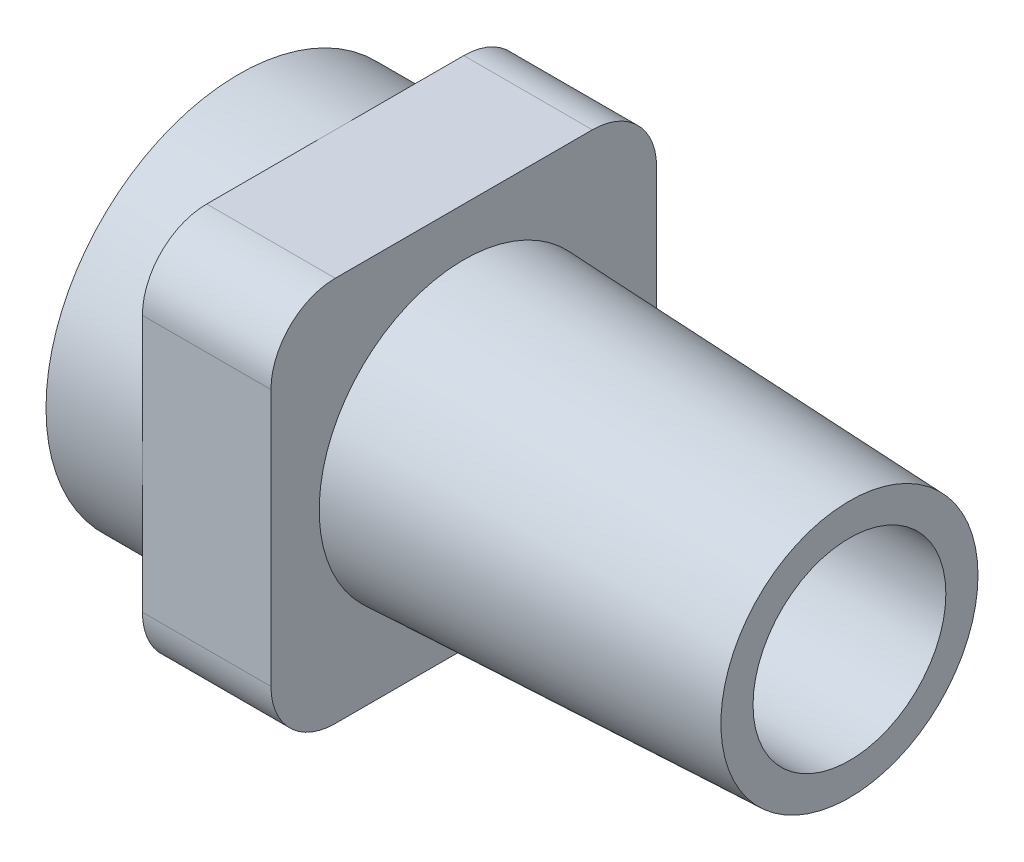
ISO-10303-21;
HEADER;
FILE_DESCRIPTION(('STEP AP214'),'2;1');
FILE_NAME('part.step','',(''),(''),'','','');
FILE_SCHEMA(('AUTOMOTIVE_DESIGN { 1 0 10303 214 1 1 1 1 }'));
ENDSEC;
DATA;
#1=APPLICATION_CONTEXT('core data for automotive mechanical design processes');
#2=APPLICATION_PROTOCOL_DEFINITION('international standard','automotive_design',2000,#1);
#3=PRODUCT_CONTEXT('',#1,'mechanical');
#4=PRODUCT('Part','Part','',(#3));
#5=PRODUCT_RELATED_PRODUCT_CATEGORY('part','',(#4));
#6=PRODUCT_DEFINITION_FORMATION('','',#4);
#7=PRODUCT_DEFINITION_CONTEXT('part definition',#1,'design');
#8=PRODUCT_DEFINITION('design','',#6,#7);
#9=PRODUCT_DEFINITION_SHAPE('','',#8);
#10=(LENGTH_UNIT() NAMED_UNIT(*) SI_UNIT(.MILLI.,.METRE.));
#11=(NAMED_UNIT(*) PLANE_ANGLE_UNIT() SI_UNIT($,.RADIAN.));
#12=(NAMED_UNIT(*) SI_UNIT($,.STERADIAN.) SOLID_ANGLE_UNIT());
#13=UNCERTAINTY_MEASURE_WITH_UNIT(LENGTH_MEASURE(1.E-05),#10,'distance_accuracy_value','');
#14=(GEOMETRIC_REPRESENTATION_CONTEXT(3) GLOBAL_UNCERTAINTY_ASSIGNED_CONTEXT((#13)) GLOBAL_UNIT_ASSIGNED_CONTEXT((#10,
#11,#12)) REPRESENTATION_CONTEXT('',''));
#15=CARTESIAN_POINT('',(0.,0.,0.));
#16=DIRECTION('',(0.,0.,1.));
#17=DIRECTION('',(1.,0.,0.));
#18=AXIS2_PLACEMENT_3D('',#15,#16,#17);
#19=CARTESIAN_POINT('',(1.,0.,0.));
#20=DIRECTION('',(1.,0.,0.));
#21=DIRECTION('',(0.,0.,-1.));
#22=AXIS2_PLACEMENT_3D('',#19,#20,#21);
#23=PLANE('',#22);
#24=DIRECTION('',(0.,-1.,0.));
#25=VECTOR('',#24,1.);
#26=CARTESIAN_POINT('',(1.,3.,3.));
#27=LINE('',#26,#25);
#28=CARTESIAN_POINT('',(1.,2.,3.));
#29=VERTEX_POINT('',#28);
#30=CARTESIAN_POINT('',(1.,-2.,3.));
#31=VERTEX_POINT('',#30);
#32=EDGE_CURVE('E148',#29,#31,#27,.T.);
#33=ORIENTED_EDGE('',*,*,#32,.T.);
#34=CARTESIAN_POINT('',(1.,-2.,2.));
#35=DIRECTION('',(1.,0.,0.));
#36=DIRECTION('',(0.,0.,-1.));
#37=AXIS2_PLACEMENT_3D('',#34,#35,#36);
#38=CIRCLE('',#37,1.);
#39=CARTESIAN_POINT('',(1.,-3.,2.));
#40=VERTEX_POINT('',#39);
#41=EDGE_CURVE('E187',#31,#40,#38,.T.);
#42=ORIENTED_EDGE('',*,*,#41,.T.);
#43=DIRECTION('',(0.,0.,-1.));
#44=VECTOR('',#43,1.);
#45=CARTESIAN_POINT('',(1.,-3.,3.));
#46=LINE('',#45,#44);
#47=CARTESIAN_POINT('',(1.,-3.,-2.));
#48=VERTEX_POINT('',#47);
#49=EDGE_CURVE('E146',#40,#48,#46,.T.);
#50=ORIENTED_EDGE('',*,*,#49,.T.);
#51=CARTESIAN_POINT('',(1.,-2.,-2.));
#52=DIRECTION('',(1.,0.,0.));
#53=DIRECTION('',(0.,0.,-1.));
#54=AXIS2_PLACEMENT_3D('',#51,#52,#53);
#55=CIRCLE('',#54,1.);
#56=CARTESIAN_POINT('',(1.,-2.,-3.));
#57=VERTEX_POINT('',#56);
#58=EDGE_CURVE('E185',#48,#57,#55,.T.);
#59=ORIENTED_EDGE('',*,*,#58,.T.);
#60=DIRECTION('',(0.,1.,0.));
#61=VECTOR('',#60,1.);
#62=CARTESIAN_POINT('',(1.,3.,-3.));
#63=LINE('',#62,#61);
#64=CARTESIAN_POINT('',(1.,2.,-3.));
#65=VERTEX_POINT('',#64);
#66=EDGE_CURVE('E153',#57,#65,#63,.T.);
#67=ORIENTED_EDGE('',*,*,#66,.T.);
#68=CARTESIAN_POINT('',(1.,2.,-2.));
#69=DIRECTION('',(1.,0.,0.));
#70=DIRECTION('',(0.,0.,-1.));
#71=AXIS2_PLACEMENT_3D('',#68,#69,#70);
#72=CIRCLE('',#71,1.);
#73=CARTESIAN_POINT('',(1.,3.,-2.));
#74=VERTEX_POINT('',#73);
#75=EDGE_CURVE('E183',#65,#74,#72,.T.);
#76=ORIENTED_EDGE('',*,*,#75,.T.);
#77=DIRECTION('',(0.,0.,1.));
#78=VECTOR('',#77,1.);
#79=CARTESIAN_POINT('',(1.,3.,3.));
#80=LINE('',#79,#78);
#81=CARTESIAN_POINT('',(1.,3.,2.));
#82=VERTEX_POINT('',#81);
#83=EDGE_CURVE('E156',#74,#82,#80,.T.);
#84=ORIENTED_EDGE('',*,*,#83,.T.);
#85=CARTESIAN_POINT('',(1.,2.,2.));
#86=DIRECTION('',(1.,0.,0.));
#87=DIRECTION('',(0.,0.,-1.));
#88=AXIS2_PLACEMENT_3D('',#85,#86,#87);
#89=CIRCLE('',#88,1.);
#90=EDGE_CURVE('E181',#82,#29,#89,.T.);
#91=ORIENTED_EDGE('',*,*,#90,.T.);
#92=EDGE_LOOP('',(#33,#42,#50,#59,#67,#76,#84,#91));
#93=FACE_BOUND('',#92,.T.);
#94=CARTESIAN_POINT('',(1.,0.,0.));
#95=DIRECTION('',(1.,0.,0.));
#96=DIRECTION('',(0.,0.,-1.));
#97=AXIS2_PLACEMENT_3D('',#94,#95,#96);
#98=CIRCLE('',#97,2.25);
#99=CARTESIAN_POINT('',(1.,0.,-2.25));
#100=VERTEX_POINT('',#99);
#101=EDGE_CURVE('E170',#100,#100,#98,.T.);
#102=ORIENTED_EDGE('',*,*,#101,.F.);
#103=EDGE_LOOP('',(#102));
#104=FACE_BOUND('',#103,.T.);
#105=ADVANCED_FACE('F36',(#93,#104),#23,.T.);
#106=CARTESIAN_POINT('',(-1.,0.,0.));
#107=DIRECTION('',(1.,0.,0.));
#108=DIRECTION('',(0.,0.,-1.));
#109=AXIS2_PLACEMENT_3D('',#106,#107,#108);
#110=PLANE('',#109);
#111=DIRECTION('',(0.,-1.,0.));
#112=VECTOR('',#111,1.);
#113=CARTESIAN_POINT('',(-1.,3.,3.));
#114=LINE('',#113,#112);
#115=CARTESIAN_POINT('',(-1.,2.,3.));
#116=VERTEX_POINT('',#115);
#117=CARTESIAN_POINT('',(-1.,0.,3.));
#118=VERTEX_POINT('',#117);
#119=EDGE_CURVE('E112',#116,#118,#114,.T.);
#120=ORIENTED_EDGE('',*,*,#119,.F.);
#121=CARTESIAN_POINT('',(-1.,2.,2.));
#122=DIRECTION('',(1.,0.,0.));
#123=DIRECTION('',(0.,0.,-1.));
#124=AXIS2_PLACEMENT_3D('',#121,#122,#123);
#125=CIRCLE('',#124,1.);
#126=CARTESIAN_POINT('',(-1.,3.,2.));
#127=VERTEX_POINT('',#126);
#128=EDGE_CURVE('E12',#116,#127,#125,.F.);
#129=ORIENTED_EDGE('',*,*,#128,.T.);
#130=DIRECTION('',(0.,0.,1.));
#131=VECTOR('',#130,1.);
#132=CARTESIAN_POINT('',(-1.,3.,3.));
#133=LINE('',#132,#131);
#134=CARTESIAN_POINT('',(-1.,3.,0.));
#135=VERTEX_POINT('',#134);
#136=EDGE_CURVE('E135',#135,#127,#133,.T.);
#137=ORIENTED_EDGE('',*,*,#136,.F.);
#138=CARTESIAN_POINT('',(-1.,0.,0.));
#139=DIRECTION('',(-1.,0.,0.));
#140=DIRECTION('',(0.,0.,1.));
#141=AXIS2_PLACEMENT_3D('',#138,#139,#140);
#142=CIRCLE('',#141,3.);
#143=EDGE_CURVE('E133',#118,#135,#142,.T.);
#144=ORIENTED_EDGE('',*,*,#143,.F.);
#145=EDGE_LOOP('',(#120,#129,#137,#144));
#146=FACE_BOUND('',#145,.T.);
#147=ADVANCED_FACE('F134',(#146),#110,.F.);
#148=CARTESIAN_POINT('',(-1.,3.,-2.));
#149=VERTEX_POINT('',#148);
#150=EDGE_CURVE('E131',#149,#135,#133,.T.);
#151=ORIENTED_EDGE('',*,*,#150,.F.);
#152=CARTESIAN_POINT('',(-1.,2.,-2.));
#153=DIRECTION('',(1.,0.,0.));
#154=DIRECTION('',(0.,0.,-1.));
#155=AXIS2_PLACEMENT_3D('',#152,#153,#154);
#156=CIRCLE('',#155,1.);
#157=CARTESIAN_POINT('',(-1.,2.,-3.));
#158=VERTEX_POINT('',#157);
#159=EDGE_CURVE('E44',#149,#158,#156,.F.);
#160=ORIENTED_EDGE('',*,*,#159,.T.);
#161=DIRECTION('',(0.,1.,0.));
#162=VECTOR('',#161,1.);
#163=CARTESIAN_POINT('',(-1.,3.,-3.));
#164=LINE('',#163,#162);
#165=CARTESIAN_POINT('',(-1.,0.,-3.));
#166=VERTEX_POINT('',#165);
#167=EDGE_CURVE('E164',#166,#158,#164,.T.);
#168=ORIENTED_EDGE('',*,*,#167,.F.);
#169=EDGE_CURVE('E141',#135,#166,#142,.T.);
#170=ORIENTED_EDGE('',*,*,#169,.F.);
#171=EDGE_LOOP('',(#151,#160,#168,#170));
#172=FACE_BOUND('',#171,.T.);
#173=ADVANCED_FACE('F203',(#172),#110,.F.);
#174=CARTESIAN_POINT('',(-1.,-2.,-3.));
#175=VERTEX_POINT('',#174);
#176=EDGE_CURVE('E162',#175,#166,#164,.T.);
#177=ORIENTED_EDGE('',*,*,#176,.F.);
#178=CARTESIAN_POINT('',(-1.,-2.,-2.));
#179=DIRECTION('',(1.,0.,0.));
#180=DIRECTION('',(0.,0.,-1.));
#181=AXIS2_PLACEMENT_3D('',#178,#179,#180);
#182=CIRCLE('',#181,1.);
#183=CARTESIAN_POINT('',(-1.,-3.,-2.));
#184=VERTEX_POINT('',#183);
#185=EDGE_CURVE('E194',#175,#184,#182,.F.);
#186=ORIENTED_EDGE('',*,*,#185,.T.);
#187=DIRECTION('',(0.,0.,-1.));
#188=VECTOR('',#187,1.);
#189=CARTESIAN_POINT('',(-1.,-3.,3.));
#190=LINE('',#189,#188);
#191=CARTESIAN_POINT('',(-1.,-3.,0.));
#192=VERTEX_POINT('',#191);
#193=EDGE_CURVE('E121',#192,#184,#190,.T.);
#194=ORIENTED_EDGE('',*,*,#193,.F.);
#195=EDGE_CURVE('E145',#166,#192,#142,.T.);
#196=ORIENTED_EDGE('',*,*,#195,.F.);
#197=EDGE_LOOP('',(#177,#186,#194,#196));
#198=FACE_BOUND('',#197,.T.);
#199=ADVANCED_FACE('F233',(#198),#110,.F.);
#200=CARTESIAN_POINT('',(1.,3.,-3.));
#201=DIRECTION('',(0.,0.,1.));
#202=DIRECTION('',(1.,0.,0.));
#203=AXIS2_PLACEMENT_3D('',#200,#201,#202);
#204=PLANE('',#203);
#205=ORIENTED_EDGE('',*,*,#66,.F.);
#206=DIRECTION('',(-1.,0.,0.));
#207=VECTOR('',#206,1.);
#208=CARTESIAN_POINT('',(1.,-2.,-3.));
#209=LINE('',#208,#207);
#210=EDGE_CURVE('E191',#57,#175,#209,.T.);
#211=ORIENTED_EDGE('',*,*,#210,.T.);
#212=ORIENTED_EDGE('',*,*,#176,.T.);
#213=ORIENTED_EDGE('',*,*,#167,.T.);
#214=DIRECTION('',(-1.,0.,0.));
#215=VECTOR('',#214,1.);
#216=CARTESIAN_POINT('',(1.,2.,-3.));
#217=LINE('',#216,#215);
#218=EDGE_CURVE('E189',#158,#65,#217,.F.);
#219=ORIENTED_EDGE('',*,*,#218,.T.);
#220=EDGE_LOOP('',(#205,#211,#212,#213,#219));
#221=FACE_BOUND('',#220,.T.);
#222=ADVANCED_FACE('F207',(#221),#204,.F.);
#223=CARTESIAN_POINT('',(1.,3.,3.));
#224=DIRECTION('',(0.,-1.,0.));
#225=DIRECTION('',(0.,0.,-1.));
#226=AXIS2_PLACEMENT_3D('',#223,#224,#225);
#227=PLANE('',#226);
#228=ORIENTED_EDGE('',*,*,#83,.F.);
#229=DIRECTION('',(-1.,0.,0.));
#230=VECTOR('',#229,1.);
#231=CARTESIAN_POINT('',(1.,3.,-2.));
#232=LINE('',#231,#230);
#233=EDGE_CURVE('E198',#74,#149,#232,.T.);
#234=ORIENTED_EDGE('',*,*,#233,.T.);
#235=ORIENTED_EDGE('',*,*,#150,.T.);
#236=ORIENTED_EDGE('',*,*,#136,.T.);
#237=DIRECTION('',(-1.,0.,0.));
#238=VECTOR('',#237,1.);
#239=CARTESIAN_POINT('',(1.,3.,2.));
#240=LINE('',#239,#238);
#241=EDGE_CURVE('E196',#127,#82,#240,.F.);
#242=ORIENTED_EDGE('',*,*,#241,.T.);
#243=EDGE_LOOP('',(#228,#234,#235,#236,#242));
#244=FACE_BOUND('',#243,.T.);
#245=ADVANCED_FACE('F216',(#244),#227,.F.);
#246=CARTESIAN_POINT('',(1.,3.,3.));
#247=DIRECTION('',(0.,0.,-1.));
#248=DIRECTION('',(0.,1.,0.));
#249=AXIS2_PLACEMENT_3D('',#246,#247,#248);
#250=PLANE('',#249);
#251=CARTESIAN_POINT('',(-1.,-2.,3.));
#252=VERTEX_POINT('',#251);
#253=EDGE_CURVE('E115',#118,#252,#114,.T.);
#254=ORIENTED_EDGE('',*,*,#253,.T.);
#255=DIRECTION('',(-1.,0.,0.));
#256=VECTOR('',#255,1.);
#257=CARTESIAN_POINT('',(1.,-2.,3.));
#258=LINE('',#257,#256);
#259=EDGE_CURVE('E179',#252,#31,#258,.F.);
#260=ORIENTED_EDGE('',*,*,#259,.T.);
#261=ORIENTED_EDGE('',*,*,#32,.F.);
#262=DIRECTION('',(-1.,0.,0.));
#263=VECTOR('',#262,1.);
#264=CARTESIAN_POINT('',(1.,2.,3.));
#265=LINE('',#264,#263);
#266=EDGE_CURVE('E119',#29,#116,#265,.T.);
#267=ORIENTED_EDGE('',*,*,#266,.T.);
#268=ORIENTED_EDGE('',*,*,#119,.T.);
#269=EDGE_LOOP('',(#254,#260,#261,#267,#268));
#270=FACE_BOUND('',#269,.T.);
#271=ADVANCED_FACE('F114',(#270),#250,.F.);
#272=CARTESIAN_POINT('',(1.,-3.,3.));
#273=DIRECTION('',(0.,1.,0.));
#274=DIRECTION('',(0.,0.,1.));
#275=AXIS2_PLACEMENT_3D('',#272,#273,#274);
#276=PLANE('',#275);
#277=ORIENTED_EDGE('',*,*,#49,.F.);
#278=DIRECTION('',(-1.,0.,0.));
#279=VECTOR('',#278,1.);
#280=CARTESIAN_POINT('',(1.,-3.,2.));
#281=LINE('',#280,#279);
#282=CARTESIAN_POINT('',(-1.,-3.,2.));
#283=VERTEX_POINT('',#282);
#284=EDGE_CURVE('E174',#40,#283,#281,.T.);
#285=ORIENTED_EDGE('',*,*,#284,.T.);
#286=EDGE_CURVE('E157',#283,#192,#190,.T.);
#287=ORIENTED_EDGE('',*,*,#286,.T.);
#288=ORIENTED_EDGE('',*,*,#193,.T.);
#289=DIRECTION('',(-1.,0.,0.));
#290=VECTOR('',#289,1.);
#291=CARTESIAN_POINT('',(1.,-3.,-2.));
#292=LINE('',#291,#290);
#293=EDGE_CURVE('E172',#184,#48,#292,.F.);
#294=ORIENTED_EDGE('',*,*,#293,.T.);
#295=EDGE_LOOP('',(#277,#285,#287,#288,#294));
#296=FACE_BOUND('',#295,.T.);
#297=ADVANCED_FACE('F226',(#296),#276,.F.);
#298=ORIENTED_EDGE('',*,*,#286,.F.);
#299=CARTESIAN_POINT('',(-1.,-2.,2.));
#300=DIRECTION('',(1.,0.,0.));
#301=DIRECTION('',(0.,0.,-1.));
#302=AXIS2_PLACEMENT_3D('',#299,#300,#301);
#303=CIRCLE('',#302,1.);
#304=EDGE_CURVE('E130',#283,#252,#303,.F.);
#305=ORIENTED_EDGE('',*,*,#304,.T.);
#306=ORIENTED_EDGE('',*,*,#253,.F.);
#307=EDGE_CURVE('E128',#192,#118,#142,.T.);
#308=ORIENTED_EDGE('',*,*,#307,.F.);
#309=EDGE_LOOP('',(#298,#305,#306,#308));
#310=FACE_BOUND('',#309,.T.);
#311=ADVANCED_FACE('F126',(#310),#110,.F.);
#312=CARTESIAN_POINT('',(-2.5,0.,0.));
#313=DIRECTION('',(1.,0.,0.));
#314=DIRECTION('',(0.,0.,-1.));
#315=AXIS2_PLACEMENT_3D('',#312,#313,#314);
#316=CYLINDRICAL_SURFACE('',#315,3.);
#317=CARTESIAN_POINT('',(-2.5,0.,0.));
#318=DIRECTION('',(-1.,0.,0.));
#319=DIRECTION('',(0.,0.,1.));
#320=AXIS2_PLACEMENT_3D('',#317,#318,#319);
#321=CIRCLE('',#320,3.);
#322=CARTESIAN_POINT('',(-2.5,0.,3.));
#323=VERTEX_POINT('',#322);
#324=EDGE_CURVE('E138',#323,#323,#321,.T.);
#325=ORIENTED_EDGE('',*,*,#324,.F.);
#326=EDGE_LOOP('',(#325));
#327=FACE_BOUND('',#326,.T.);
#328=ORIENTED_EDGE('',*,*,#143,.T.);
#329=ORIENTED_EDGE('',*,*,#169,.T.);
#330=ORIENTED_EDGE('',*,*,#195,.T.);
#331=ORIENTED_EDGE('',*,*,#307,.T.);
#332=EDGE_LOOP('',(#328,#329,#330,#331));
#333=FACE_BOUND('',#332,.T.);
#334=ADVANCED_FACE('F143',(#327,#333),#316,.T.);
#335=CARTESIAN_POINT('',(-2.5,0.,0.));
#336=DIRECTION('',(-1.,0.,0.));
#337=DIRECTION('',(0.,0.,1.));
#338=AXIS2_PLACEMENT_3D('',#335,#336,#337);
#339=PLANE('',#338);
#340=CARTESIAN_POINT('',(-2.5,0.,0.));
#341=DIRECTION('',(1.,0.,0.));
#342=DIRECTION('',(0.,0.,-1.));
#343=AXIS2_PLACEMENT_3D('',#340,#341,#342);
#344=CIRCLE('',#343,1.5);
#345=CARTESIAN_POINT('',(-2.5,0.,-1.5));
#346=VERTEX_POINT('',#345);
#347=EDGE_CURVE('E171',#346,#346,#344,.T.);
#348=ORIENTED_EDGE('',*,*,#347,.T.);
#349=EDGE_LOOP('',(#348));
#350=FACE_BOUND('',#349,.T.);
#351=ORIENTED_EDGE('',*,*,#324,.T.);
#352=EDGE_LOOP('',(#351));
#353=FACE_BOUND('',#352,.T.);
#354=ADVANCED_FACE('F251',(#350,#353),#339,.T.);
#355=CARTESIAN_POINT('',(7.,0.,0.));
#356=DIRECTION('',(1.,0.,0.));
#357=DIRECTION('',(0.,0.,-1.));
#358=AXIS2_PLACEMENT_3D('',#355,#356,#357);
#359=PLANE('',#358);
#360=CARTESIAN_POINT('',(7.,0.,0.));
#361=DIRECTION('',(1.,0.,0.));
#362=DIRECTION('',(0.,0.,-1.));
#363=AXIS2_PLACEMENT_3D('',#360,#361,#362);
#364=CIRCLE('',#363,1.5);
#365=CARTESIAN_POINT('',(7.,0.,-1.5));
#366=VERTEX_POINT('',#365);
#367=EDGE_CURVE('E167',#366,#366,#364,.T.);
#368=ORIENTED_EDGE('',*,*,#367,.F.);
#369=EDGE_LOOP('',(#368));
#370=FACE_BOUND('',#369,.T.);
#371=CARTESIAN_POINT('',(7.,0.,0.));
#372=DIRECTION('',(1.,0.,0.));
#373=DIRECTION('',(0.,0.,-1.));
#374=AXIS2_PLACEMENT_3D('',#371,#372,#373);
#375=CIRCLE('',#374,2.);
#376=CARTESIAN_POINT('',(7.,0.,-2.));
#377=VERTEX_POINT('',#376);
#378=EDGE_CURVE('E139',#377,#377,#375,.T.);
#379=ORIENTED_EDGE('',*,*,#378,.T.);
#380=EDGE_LOOP('',(#379));
#381=FACE_BOUND('',#380,.T.);
#382=ADVANCED_FACE('F255',(#370,#381),#359,.T.);
#383=CARTESIAN_POINT('',(7.,0.,0.));
#384=DIRECTION('',(-1.,0.,0.));
#385=DIRECTION('',(0.,0.,1.));
#386=AXIS2_PLACEMENT_3D('',#383,#384,#385);
#387=CONICAL_SURFACE('',#386,2.,0.0416425790985884);
#388=ORIENTED_EDGE('',*,*,#101,.T.);
#389=EDGE_LOOP('',(#388));
#390=FACE_BOUND('',#389,.T.);
#391=ORIENTED_EDGE('',*,*,#378,.F.);
#392=EDGE_LOOP('',(#391));
#393=FACE_BOUND('',#392,.T.);
#394=ADVANCED_FACE('F260',(#390,#393),#387,.T.);
#395=CARTESIAN_POINT('',(-2.5,0.,0.));
#396=DIRECTION('',(1.,0.,0.));
#397=DIRECTION('',(0.,0.,-1.));
#398=AXIS2_PLACEMENT_3D('',#395,#396,#397);
#399=CYLINDRICAL_SURFACE('',#398,1.5);
#400=ORIENTED_EDGE('',*,*,#367,.T.);
#401=EDGE_LOOP('',(#400));
#402=FACE_BOUND('',#401,.T.);
#403=ORIENTED_EDGE('',*,*,#347,.F.);
#404=EDGE_LOOP('',(#403));
#405=FACE_BOUND('',#404,.T.);
#406=ADVANCED_FACE('F297',(#402,#405),#399,.F.);
#407=CARTESIAN_POINT('',(1.,-2.,2.));
#408=DIRECTION('',(-1.,0.,0.));
#409=DIRECTION('',(0.,0.,1.));
#410=AXIS2_PLACEMENT_3D('',#407,#408,#409);
#411=CYLINDRICAL_SURFACE('',#410,1.);
#412=ORIENTED_EDGE('',*,*,#41,.F.);
#413=ORIENTED_EDGE('',*,*,#259,.F.);
#414=ORIENTED_EDGE('',*,*,#304,.F.);
#415=ORIENTED_EDGE('',*,*,#284,.F.);
#416=EDGE_LOOP('',(#412,#413,#414,#415));
#417=FACE_BOUND('',#416,.T.);
#418=ADVANCED_FACE('F221',(#417),#411,.T.);
#419=CARTESIAN_POINT('',(1.,-2.,-2.));
#420=DIRECTION('',(-1.,0.,0.));
#421=DIRECTION('',(0.,0.,1.));
#422=AXIS2_PLACEMENT_3D('',#419,#420,#421);
#423=CYLINDRICAL_SURFACE('',#422,1.);
#424=ORIENTED_EDGE('',*,*,#58,.F.);
#425=ORIENTED_EDGE('',*,*,#293,.F.);
#426=ORIENTED_EDGE('',*,*,#185,.F.);
#427=ORIENTED_EDGE('',*,*,#210,.F.);
#428=EDGE_LOOP('',(#424,#425,#426,#427));
#429=FACE_BOUND('',#428,.T.);
#430=ADVANCED_FACE('F230',(#429),#423,.T.);
#431=CARTESIAN_POINT('',(1.,2.,-2.));
#432=DIRECTION('',(-1.,0.,0.));
#433=DIRECTION('',(0.,0.,1.));
#434=AXIS2_PLACEMENT_3D('',#431,#432,#433);
#435=CYLINDRICAL_SURFACE('',#434,1.);
#436=ORIENTED_EDGE('',*,*,#75,.F.);
#437=ORIENTED_EDGE('',*,*,#218,.F.);
#438=ORIENTED_EDGE('',*,*,#159,.F.);
#439=ORIENTED_EDGE('',*,*,#233,.F.);
#440=EDGE_LOOP('',(#436,#437,#438,#439));
#441=FACE_BOUND('',#440,.T.);
#442=ADVANCED_FACE('F210',(#441),#435,.T.);
#443=CARTESIAN_POINT('',(1.,2.,2.));
#444=DIRECTION('',(-1.,0.,0.));
#445=DIRECTION('',(0.,0.,1.));
#446=AXIS2_PLACEMENT_3D('',#443,#444,#445);
#447=CYLINDRICAL_SURFACE('',#446,1.);
#448=ORIENTED_EDGE('',*,*,#90,.F.);
#449=ORIENTED_EDGE('',*,*,#241,.F.);
#450=ORIENTED_EDGE('',*,*,#128,.F.);
#451=ORIENTED_EDGE('',*,*,#266,.F.);
#452=EDGE_LOOP('',(#448,#449,#450,#451));
#453=FACE_BOUND('',#452,.T.);
#454=ADVANCED_FACE('F38',(#453),#447,.T.);
#455=CLOSED_SHELL('',(#105,#147,#173,#199,#222,#245,#271,#297,#311,#334,#354,#382,#394,#406,
#418,#430,#442,#454));
#456=MANIFOLD_SOLID_BREP('B2',#455);
#457=ADVANCED_BREP_SHAPE_REPRESENTATION('',(#18,#456),#14);
#458=SHAPE_DEFINITION_REPRESENTATION(#9,#457);
ENDSEC;
END-ISO-10303-21;
